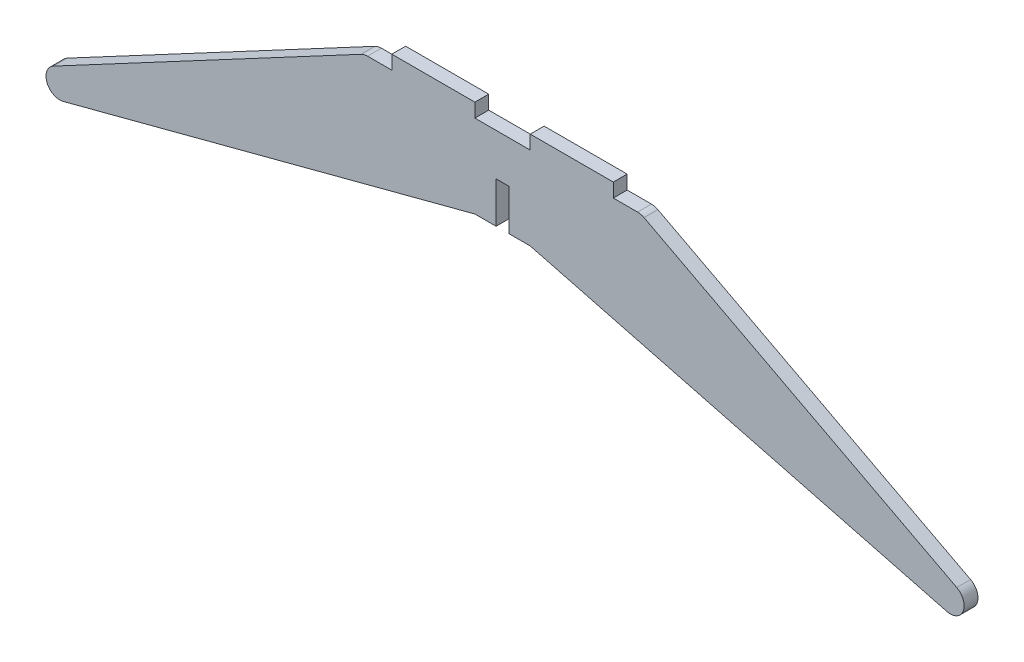
ISO-10303-21;
HEADER;
FILE_DESCRIPTION(('STEP AP214'),'2;1');
FILE_NAME('part.step','',(''),(''),'','','');
FILE_SCHEMA(('AUTOMOTIVE_DESIGN { 1 0 10303 214 1 1 1 1 }'));
ENDSEC;
DATA;
#1=APPLICATION_CONTEXT('core data for automotive mechanical design processes');
#2=APPLICATION_PROTOCOL_DEFINITION('international standard','automotive_design',2000,#1);
#3=PRODUCT_CONTEXT('',#1,'mechanical');
#4=PRODUCT('Part','Part','',(#3));
#5=PRODUCT_RELATED_PRODUCT_CATEGORY('part','',(#4));
#6=PRODUCT_DEFINITION_FORMATION('','',#4);
#7=PRODUCT_DEFINITION_CONTEXT('part definition',#1,'design');
#8=PRODUCT_DEFINITION('design','',#6,#7);
#9=PRODUCT_DEFINITION_SHAPE('','',#8);
#10=(LENGTH_UNIT() NAMED_UNIT(*) SI_UNIT(.MILLI.,.METRE.));
#11=(NAMED_UNIT(*) PLANE_ANGLE_UNIT() SI_UNIT($,.RADIAN.));
#12=(NAMED_UNIT(*) SI_UNIT($,.STERADIAN.) SOLID_ANGLE_UNIT());
#13=UNCERTAINTY_MEASURE_WITH_UNIT(LENGTH_MEASURE(1.E-05),#10,'distance_accuracy_value','');
#14=(GEOMETRIC_REPRESENTATION_CONTEXT(3) GLOBAL_UNCERTAINTY_ASSIGNED_CONTEXT((#13)) GLOBAL_UNIT_ASSIGNED_CONTEXT((#10,
#11,#12)) REPRESENTATION_CONTEXT('',''));
#15=CARTESIAN_POINT('',(0.,0.,0.));
#16=DIRECTION('',(0.,0.,1.));
#17=DIRECTION('',(1.,0.,0.));
#18=AXIS2_PLACEMENT_3D('',#15,#16,#17);
#19=CARTESIAN_POINT('',(25.4000003542452,3.17499995722947,3.175));
#20=DIRECTION('',(-0.999999999999994,1.11573281645451E-07,0.));
#21=DIRECTION('',(-1.11573281645451E-07,-0.999999999999994,0.));
#22=AXIS2_PLACEMENT_3D('',#19,#20,#21);
#23=PLANE('',#22);
#24=DIRECTION('',(1.11573281645451E-07,0.999999999999994,0.));
#25=VECTOR('',#24,1.);
#26=CARTESIAN_POINT('',(25.4000003542452,3.17499995722947,0.));
#27=LINE('',#26,#25);
#28=CARTESIAN_POINT('',(25.4,0.,0.));
#29=VERTEX_POINT('',#28);
#30=CARTESIAN_POINT('',(25.4000003542452,3.17499995722947,0.));
#31=VERTEX_POINT('',#30);
#32=EDGE_CURVE('E213',#29,#31,#27,.T.);
#33=ORIENTED_EDGE('',*,*,#32,.T.);
#34=DIRECTION('',(0.,0.,-1.));
#35=VECTOR('',#34,1.);
#36=CARTESIAN_POINT('',(25.4000003542452,3.17499995722947,3.175));
#37=LINE('',#36,#35);
#38=CARTESIAN_POINT('',(25.4000003542452,3.17499995722947,3.175));
#39=VERTEX_POINT('',#38);
#40=EDGE_CURVE('E11',#39,#31,#37,.T.);
#41=ORIENTED_EDGE('',*,*,#40,.F.);
#42=DIRECTION('',(1.11573281645451E-07,0.999999999999994,0.));
#43=VECTOR('',#42,1.);
#44=CARTESIAN_POINT('',(25.4000003542452,3.17499995722947,3.175));
#45=LINE('',#44,#43);
#46=CARTESIAN_POINT('',(25.4,0.,3.175));
#47=VERTEX_POINT('',#46);
#48=EDGE_CURVE('E255',#47,#39,#45,.T.);
#49=ORIENTED_EDGE('',*,*,#48,.F.);
#50=DIRECTION('',(0.,0.,-1.));
#51=VECTOR('',#50,1.);
#52=CARTESIAN_POINT('',(25.4,0.,3.175));
#53=LINE('',#52,#51);
#54=EDGE_CURVE('E209',#47,#29,#53,.T.);
#55=ORIENTED_EDGE('',*,*,#54,.T.);
#56=EDGE_LOOP('',(#33,#41,#49,#55));
#57=FACE_BOUND('',#56,.T.);
#58=ADVANCED_FACE('F33',(#57),#23,.F.);
#59=CARTESIAN_POINT('',(25.4000003542452,3.17499995722947,3.175));
#60=DIRECTION('',(0.,-1.,0.));
#61=DIRECTION('',(0.,0.,-1.));
#62=AXIS2_PLACEMENT_3D('',#59,#60,#61);
#63=PLANE('',#62);
#64=DIRECTION('',(-1.,0.,0.));
#65=VECTOR('',#64,1.);
#66=CARTESIAN_POINT('',(25.4000003542452,3.17499995722947,0.));
#67=LINE('',#66,#65);
#68=CARTESIAN_POINT('',(6.35000035424518,3.17499995722947,0.));
#69=VERTEX_POINT('',#68);
#70=EDGE_CURVE('E216',#31,#69,#67,.T.);
#71=ORIENTED_EDGE('',*,*,#70,.T.);
#72=DIRECTION('',(0.,0.,-1.));
#73=VECTOR('',#72,1.);
#74=CARTESIAN_POINT('',(6.35000035424518,3.17499995722947,3.175));
#75=LINE('',#74,#73);
#76=CARTESIAN_POINT('',(6.35000035424518,3.17499995722947,3.175));
#77=VERTEX_POINT('',#76);
#78=EDGE_CURVE('E41',#77,#69,#75,.T.);
#79=ORIENTED_EDGE('',*,*,#78,.F.);
#80=DIRECTION('',(-1.,0.,0.));
#81=VECTOR('',#80,1.);
#82=CARTESIAN_POINT('',(25.4000003542452,3.17499995722947,3.175));
#83=LINE('',#82,#81);
#84=EDGE_CURVE('E134',#39,#77,#83,.T.);
#85=ORIENTED_EDGE('',*,*,#84,.F.);
#86=ORIENTED_EDGE('',*,*,#40,.T.);
#87=EDGE_LOOP('',(#71,#79,#85,#86));
#88=FACE_BOUND('',#87,.T.);
#89=ADVANCED_FACE('F383',(#88),#63,.F.);
#90=CARTESIAN_POINT('',(6.35,0.,3.175));
#91=DIRECTION('',(0.999999999999994,-1.11573287382332E-07,0.));
#92=DIRECTION('',(1.11573287382332E-07,0.999999999999994,0.));
#93=AXIS2_PLACEMENT_3D('',#90,#91,#92);
#94=PLANE('',#93);
#95=DIRECTION('',(-1.11573287382332E-07,-0.999999999999994,0.));
#96=VECTOR('',#95,1.);
#97=CARTESIAN_POINT('',(6.35,0.,0.));
#98=LINE('',#97,#96);
#99=CARTESIAN_POINT('',(6.35,0.,0.));
#100=VERTEX_POINT('',#99);
#101=EDGE_CURVE('E218',#69,#100,#98,.T.);
#102=ORIENTED_EDGE('',*,*,#101,.T.);
#103=DIRECTION('',(0.,0.,-1.));
#104=VECTOR('',#103,1.);
#105=CARTESIAN_POINT('',(6.35,0.,3.175));
#106=LINE('',#105,#104);
#107=CARTESIAN_POINT('',(6.35,0.,3.175));
#108=VERTEX_POINT('',#107);
#109=EDGE_CURVE('E304',#108,#100,#106,.T.);
#110=ORIENTED_EDGE('',*,*,#109,.F.);
#111=DIRECTION('',(-1.11573287382332E-07,-0.999999999999994,0.));
#112=VECTOR('',#111,1.);
#113=CARTESIAN_POINT('',(6.35,0.,3.175));
#114=LINE('',#113,#112);
#115=EDGE_CURVE('E312',#77,#108,#114,.T.);
#116=ORIENTED_EDGE('',*,*,#115,.F.);
#117=ORIENTED_EDGE('',*,*,#78,.T.);
#118=EDGE_LOOP('',(#102,#110,#116,#117));
#119=FACE_BOUND('',#118,.T.);
#120=ADVANCED_FACE('F310',(#119),#94,.F.);
#121=CARTESIAN_POINT('',(-6.35,0.,3.175));
#122=DIRECTION('',(0.,-1.,0.));
#123=DIRECTION('',(0.,0.,-1.));
#124=AXIS2_PLACEMENT_3D('',#121,#122,#123);
#125=PLANE('',#124);
#126=DIRECTION('',(-1.,0.,0.));
#127=VECTOR('',#126,1.);
#128=CARTESIAN_POINT('',(-6.35,0.,0.));
#129=LINE('',#128,#127);
#130=CARTESIAN_POINT('',(-6.35,0.,0.));
#131=VERTEX_POINT('',#130);
#132=EDGE_CURVE('E220',#100,#131,#129,.T.);
#133=ORIENTED_EDGE('',*,*,#132,.T.);
#134=DIRECTION('',(0.,0.,-1.));
#135=VECTOR('',#134,1.);
#136=CARTESIAN_POINT('',(-6.35,0.,3.175));
#137=LINE('',#136,#135);
#138=CARTESIAN_POINT('',(-6.35,0.,3.175));
#139=VERTEX_POINT('',#138);
#140=EDGE_CURVE('E301',#139,#131,#137,.T.);
#141=ORIENTED_EDGE('',*,*,#140,.F.);
#142=DIRECTION('',(-1.,0.,0.));
#143=VECTOR('',#142,1.);
#144=CARTESIAN_POINT('',(-6.35,0.,3.175));
#145=LINE('',#144,#143);
#146=EDGE_CURVE('E330',#108,#139,#145,.T.);
#147=ORIENTED_EDGE('',*,*,#146,.F.);
#148=ORIENTED_EDGE('',*,*,#109,.T.);
#149=EDGE_LOOP('',(#133,#141,#147,#148));
#150=FACE_BOUND('',#149,.T.);
#151=ADVANCED_FACE('F321',(#150),#125,.F.);
#152=CARTESIAN_POINT('',(-6.34999964575481,3.17499995722947,3.175));
#153=DIRECTION('',(-0.999999999999994,1.11573287928702E-07,0.));
#154=DIRECTION('',(-1.11573287928702E-07,-0.999999999999994,0.));
#155=AXIS2_PLACEMENT_3D('',#152,#153,#154);
#156=PLANE('',#155);
#157=DIRECTION('',(1.11573287928702E-07,0.999999999999994,0.));
#158=VECTOR('',#157,1.);
#159=CARTESIAN_POINT('',(-6.34999964575481,3.17499995722947,0.));
#160=LINE('',#159,#158);
#161=CARTESIAN_POINT('',(-6.34999964575481,3.17499995722947,0.));
#162=VERTEX_POINT('',#161);
#163=EDGE_CURVE('E222',#131,#162,#160,.T.);
#164=ORIENTED_EDGE('',*,*,#163,.T.);
#165=DIRECTION('',(0.,0.,-1.));
#166=VECTOR('',#165,1.);
#167=CARTESIAN_POINT('',(-6.34999964575481,3.17499995722947,3.175));
#168=LINE('',#167,#166);
#169=CARTESIAN_POINT('',(-6.34999964575481,3.17499995722947,3.175));
#170=VERTEX_POINT('',#169);
#171=EDGE_CURVE('E298',#170,#162,#168,.T.);
#172=ORIENTED_EDGE('',*,*,#171,.F.);
#173=DIRECTION('',(1.11573287928702E-07,0.999999999999994,0.));
#174=VECTOR('',#173,1.);
#175=CARTESIAN_POINT('',(-6.34999964575481,3.17499995722947,3.175));
#176=LINE('',#175,#174);
#177=EDGE_CURVE('E327',#139,#170,#176,.T.);
#178=ORIENTED_EDGE('',*,*,#177,.F.);
#179=ORIENTED_EDGE('',*,*,#140,.T.);
#180=EDGE_LOOP('',(#164,#172,#178,#179));
#181=FACE_BOUND('',#180,.T.);
#182=ADVANCED_FACE('F325',(#181),#156,.F.);
#183=CARTESIAN_POINT('',(-6.34999964575481,3.17499995722947,3.175));
#184=DIRECTION('',(0.,-1.,0.));
#185=DIRECTION('',(0.,0.,-1.));
#186=AXIS2_PLACEMENT_3D('',#183,#184,#185);
#187=PLANE('',#186);
#188=DIRECTION('',(-1.,0.,0.));
#189=VECTOR('',#188,1.);
#190=CARTESIAN_POINT('',(-6.34999964575481,3.17499995722947,0.));
#191=LINE('',#190,#189);
#192=CARTESIAN_POINT('',(-25.3999996457548,3.17499995722947,0.));
#193=VERTEX_POINT('',#192);
#194=EDGE_CURVE('E224',#162,#193,#191,.T.);
#195=ORIENTED_EDGE('',*,*,#194,.T.);
#196=DIRECTION('',(0.,0.,-1.));
#197=VECTOR('',#196,1.);
#198=CARTESIAN_POINT('',(-25.3999996457548,3.17499995722947,3.175));
#199=LINE('',#198,#197);
#200=CARTESIAN_POINT('',(-25.3999996457548,3.17499995722947,3.175));
#201=VERTEX_POINT('',#200);
#202=EDGE_CURVE('E295',#201,#193,#199,.T.);
#203=ORIENTED_EDGE('',*,*,#202,.F.);
#204=DIRECTION('',(-1.,0.,0.));
#205=VECTOR('',#204,1.);
#206=CARTESIAN_POINT('',(-6.34999964575481,3.17499995722947,3.175));
#207=LINE('',#206,#205);
#208=EDGE_CURVE('E329',#170,#201,#207,.T.);
#209=ORIENTED_EDGE('',*,*,#208,.F.);
#210=ORIENTED_EDGE('',*,*,#171,.T.);
#211=EDGE_LOOP('',(#195,#203,#209,#210));
#212=FACE_BOUND('',#211,.T.);
#213=ADVANCED_FACE('F396',(#212),#187,.F.);
#214=CARTESIAN_POINT('',(-25.4,0.,3.175));
#215=DIRECTION('',(0.999999999999994,-1.11573287109147E-07,0.));
#216=DIRECTION('',(1.11573287109147E-07,0.999999999999994,0.));
#217=AXIS2_PLACEMENT_3D('',#214,#215,#216);
#218=PLANE('',#217);
#219=DIRECTION('',(-1.11573287109147E-07,-0.999999999999994,0.));
#220=VECTOR('',#219,1.);
#221=CARTESIAN_POINT('',(-25.4,0.,0.));
#222=LINE('',#221,#220);
#223=CARTESIAN_POINT('',(-25.4,0.,0.));
#224=VERTEX_POINT('',#223);
#225=EDGE_CURVE('E226',#193,#224,#222,.T.);
#226=ORIENTED_EDGE('',*,*,#225,.T.);
#227=DIRECTION('',(0.,0.,-1.));
#228=VECTOR('',#227,1.);
#229=CARTESIAN_POINT('',(-25.4,0.,3.175));
#230=LINE('',#229,#228);
#231=CARTESIAN_POINT('',(-25.4,0.,3.175));
#232=VERTEX_POINT('',#231);
#233=EDGE_CURVE('E292',#232,#224,#230,.T.);
#234=ORIENTED_EDGE('',*,*,#233,.F.);
#235=DIRECTION('',(-1.11573287109147E-07,-0.999999999999994,0.));
#236=VECTOR('',#235,1.);
#237=CARTESIAN_POINT('',(-25.4,0.,3.175));
#238=LINE('',#237,#236);
#239=EDGE_CURVE('E332',#201,#232,#238,.T.);
#240=ORIENTED_EDGE('',*,*,#239,.F.);
#241=ORIENTED_EDGE('',*,*,#202,.T.);
#242=EDGE_LOOP('',(#226,#234,#240,#241));
#243=FACE_BOUND('',#242,.T.);
#244=ADVANCED_FACE('F399',(#243),#218,.F.);
#245=CARTESIAN_POINT('',(-30.95625,0.,3.175));
#246=DIRECTION('',(0.,-1.,0.));
#247=DIRECTION('',(1.,0.,0.));
#248=AXIS2_PLACEMENT_3D('',#245,#246,#247);
#249=PLANE('',#248);
#250=DIRECTION('',(-1.,0.,0.));
#251=VECTOR('',#250,1.);
#252=CARTESIAN_POINT('',(-30.95625,0.,0.));
#253=LINE('',#252,#251);
#254=CARTESIAN_POINT('',(-30.95625,0.,0.));
#255=VERTEX_POINT('',#254);
#256=EDGE_CURVE('E228',#224,#255,#253,.T.);
#257=ORIENTED_EDGE('',*,*,#256,.T.);
#258=DIRECTION('',(0.,0.,-1.));
#259=VECTOR('',#258,1.);
#260=CARTESIAN_POINT('',(-30.95625,0.,3.175));
#261=LINE('',#260,#259);
#262=CARTESIAN_POINT('',(-30.95625,0.,3.175));
#263=VERTEX_POINT('',#262);
#264=EDGE_CURVE('E289',#263,#255,#261,.T.);
#265=ORIENTED_EDGE('',*,*,#264,.F.);
#266=DIRECTION('',(-1.,0.,0.));
#267=VECTOR('',#266,1.);
#268=CARTESIAN_POINT('',(-30.95625,0.,3.175));
#269=LINE('',#268,#267);
#270=EDGE_CURVE('E338',#232,#263,#269,.T.);
#271=ORIENTED_EDGE('',*,*,#270,.F.);
#272=ORIENTED_EDGE('',*,*,#233,.T.);
#273=EDGE_LOOP('',(#257,#265,#271,#272));
#274=FACE_BOUND('',#273,.T.);
#275=ADVANCED_FACE('F403',(#274),#249,.F.);
#276=CARTESIAN_POINT('',(-30.95625,-3.175,3.175));
#277=DIRECTION('',(0.,0.,-1.));
#278=DIRECTION('',(-1.,0.,0.));
#279=AXIS2_PLACEMENT_3D('',#276,#277,#278);
#280=CYLINDRICAL_SURFACE('',#279,3.17500000000004);
#281=CARTESIAN_POINT('',(-30.95625,-3.175,0.));
#282=DIRECTION('',(0.,0.,1.));
#283=DIRECTION('',(1.,0.,0.));
#284=AXIS2_PLACEMENT_3D('',#281,#282,#283);
#285=CIRCLE('',#284,3.17500000000004);
#286=CARTESIAN_POINT('',(-32.4503676470611,-0.373529411765896,0.));
#287=VERTEX_POINT('',#286);
#288=EDGE_CURVE('E230',#255,#287,#285,.T.);
#289=ORIENTED_EDGE('',*,*,#288,.T.);
#290=DIRECTION('',(0.,0.,-1.));
#291=VECTOR('',#290,1.);
#292=CARTESIAN_POINT('',(-32.4503676470611,-0.373529411765896,3.175));
#293=LINE('',#292,#291);
#294=CARTESIAN_POINT('',(-32.4503676470611,-0.373529411765896,3.175));
#295=VERTEX_POINT('',#294);
#296=EDGE_CURVE('E286',#295,#287,#293,.T.);
#297=ORIENTED_EDGE('',*,*,#296,.F.);
#298=CARTESIAN_POINT('',(-30.95625,-3.175,3.175));
#299=DIRECTION('',(0.,0.,1.));
#300=DIRECTION('',(1.,0.,0.));
#301=AXIS2_PLACEMENT_3D('',#298,#299,#300);
#302=CIRCLE('',#301,3.17500000000004);
#303=EDGE_CURVE('E340',#263,#295,#302,.T.);
#304=ORIENTED_EDGE('',*,*,#303,.F.);
#305=ORIENTED_EDGE('',*,*,#264,.T.);
#306=EDGE_LOOP('',(#289,#297,#304,#305));
#307=FACE_BOUND('',#306,.T.);
#308=ADVANCED_FACE('F407',(#307),#280,.T.);
#309=CARTESIAN_POINT('',(-32.4503676470611,-0.373529411765896,3.175));
#310=DIRECTION('',(0.470588235285876,-0.882352941180866,0.));
#311=DIRECTION('',(0.882352941180866,0.470588235285876,0.));
#312=AXIS2_PLACEMENT_3D('',#309,#310,#311);
#313=PLANE('',#312);
#314=DIRECTION('',(-0.882352941180866,-0.470588235285876,0.));
#315=VECTOR('',#314,1.);
#316=CARTESIAN_POINT('',(-32.4503676470611,-0.373529411765896,0.));
#317=LINE('',#316,#315);
#318=CARTESIAN_POINT('',(-103.0238866239,-38.0127395319,0.));
#319=VERTEX_POINT('',#318);
#320=EDGE_CURVE('E232',#287,#319,#317,.T.);
#321=ORIENTED_EDGE('',*,*,#320,.T.);
#322=DIRECTION('',(0.,0.,-1.));
#323=VECTOR('',#322,1.);
#324=CARTESIAN_POINT('',(-103.0238866239,-38.0127395319,3.175));
#325=LINE('',#324,#323);
#326=CARTESIAN_POINT('',(-103.0238866239,-38.0127395319,3.175));
#327=VERTEX_POINT('',#326);
#328=EDGE_CURVE('E283',#327,#319,#325,.T.);
#329=ORIENTED_EDGE('',*,*,#328,.F.);
#330=DIRECTION('',(-0.882352941180866,-0.470588235285876,0.));
#331=VECTOR('',#330,1.);
#332=CARTESIAN_POINT('',(-32.4503676470611,-0.373529411765896,3.175));
#333=LINE('',#332,#331);
#334=EDGE_CURVE('E342',#295,#327,#333,.T.);
#335=ORIENTED_EDGE('',*,*,#334,.F.);
#336=ORIENTED_EDGE('',*,*,#296,.T.);
#337=EDGE_LOOP('',(#321,#329,#335,#336));
#338=FACE_BOUND('',#337,.T.);
#339=ADVANCED_FACE('F411',(#338),#313,.F.);
#340=CARTESIAN_POINT('',(-101.529768981527,-40.8142101226345,3.175));
#341=DIRECTION('',(0.,0.,-1.));
#342=DIRECTION('',(-1.,0.,0.));
#343=AXIS2_PLACEMENT_3D('',#340,#341,#342);
#344=CYLINDRICAL_SURFACE('',#343,3.175);
#345=CARTESIAN_POINT('',(-101.529768981527,-40.8142101226345,0.));
#346=DIRECTION('',(0.,0.,1.));
#347=DIRECTION('',(1.,0.,0.));
#348=AXIS2_PLACEMENT_3D('',#345,#346,#347);
#349=CIRCLE('',#348,3.175);
#350=CARTESIAN_POINT('',(-100.721752751926,-43.8846717772885,0.));
#351=VERTEX_POINT('',#350);
#352=EDGE_CURVE('E234',#319,#351,#349,.T.);
#353=ORIENTED_EDGE('',*,*,#352,.T.);
#354=DIRECTION('',(0.,0.,-1.));
#355=VECTOR('',#354,1.);
#356=CARTESIAN_POINT('',(-100.721752751926,-43.8846717772885,3.175));
#357=LINE('',#356,#355);
#358=CARTESIAN_POINT('',(-100.721752751926,-43.8846717772885,3.175));
#359=VERTEX_POINT('',#358);
#360=EDGE_CURVE('E280',#359,#351,#357,.T.);
#361=ORIENTED_EDGE('',*,*,#360,.F.);
#362=CARTESIAN_POINT('',(-101.529768981527,-40.8142101226345,3.175));
#363=DIRECTION('',(0.,0.,1.));
#364=DIRECTION('',(1.,0.,0.));
#365=AXIS2_PLACEMENT_3D('',#362,#363,#364);
#366=CIRCLE('',#365,3.175);
#367=EDGE_CURVE('E344',#327,#359,#366,.T.);
#368=ORIENTED_EDGE('',*,*,#367,.F.);
#369=ORIENTED_EDGE('',*,*,#328,.T.);
#370=EDGE_LOOP('',(#353,#361,#368,#369));
#371=FACE_BOUND('',#370,.T.);
#372=ADVANCED_FACE('F415',(#371),#344,.T.);
#373=CARTESIAN_POINT('',(-100.721752751926,-43.8846717772885,3.175));
#374=DIRECTION('',(-0.254493299284109,0.967074537261471,0.));
#375=DIRECTION('',(-0.967074537261471,-0.254493299284109,0.));
#376=AXIS2_PLACEMENT_3D('',#373,#374,#375);
#377=PLANE('',#376);
#378=DIRECTION('',(0.967074537261471,0.254493299284109,0.));
#379=VECTOR('',#378,1.);
#380=CARTESIAN_POINT('',(-100.721752751926,-43.8846717772885,0.));
#381=LINE('',#380,#379);
#382=CARTESIAN_POINT('',(-6.35,-19.05,0.));
#383=VERTEX_POINT('',#382);
#384=EDGE_CURVE('E236',#351,#383,#381,.T.);
#385=ORIENTED_EDGE('',*,*,#384,.T.);
#386=DIRECTION('',(0.,0.,-1.));
#387=VECTOR('',#386,1.);
#388=CARTESIAN_POINT('',(-6.35,-19.05,3.175));
#389=LINE('',#388,#387);
#390=CARTESIAN_POINT('',(-6.35,-19.05,3.175));
#391=VERTEX_POINT('',#390);
#392=EDGE_CURVE('E277',#391,#383,#389,.T.);
#393=ORIENTED_EDGE('',*,*,#392,.F.);
#394=DIRECTION('',(0.967074537261471,0.254493299284109,0.));
#395=VECTOR('',#394,1.);
#396=CARTESIAN_POINT('',(-100.721752751926,-43.8846717772885,3.175));
#397=LINE('',#396,#395);
#398=EDGE_CURVE('E346',#359,#391,#397,.T.);
#399=ORIENTED_EDGE('',*,*,#398,.F.);
#400=ORIENTED_EDGE('',*,*,#360,.T.);
#401=EDGE_LOOP('',(#385,#393,#399,#400));
#402=FACE_BOUND('',#401,.T.);
#403=ADVANCED_FACE('F419',(#402),#377,.F.);
#404=CARTESIAN_POINT('',(-6.35,-19.05,3.175));
#405=DIRECTION('',(0.,1.,0.));
#406=DIRECTION('',(0.,0.,1.));
#407=AXIS2_PLACEMENT_3D('',#404,#405,#406);
#408=PLANE('',#407);
#409=DIRECTION('',(1.,0.,0.));
#410=VECTOR('',#409,1.);
#411=CARTESIAN_POINT('',(-6.35,-19.05,0.));
#412=LINE('',#411,#410);
#413=CARTESIAN_POINT('',(-1.4859,-19.05,0.));
#414=VERTEX_POINT('',#413);
#415=EDGE_CURVE('E238',#383,#414,#412,.T.);
#416=ORIENTED_EDGE('',*,*,#415,.T.);
#417=DIRECTION('',(0.,0.,-1.));
#418=VECTOR('',#417,1.);
#419=CARTESIAN_POINT('',(-1.4859,-19.05,3.175));
#420=LINE('',#419,#418);
#421=CARTESIAN_POINT('',(-1.4859,-19.05,3.175));
#422=VERTEX_POINT('',#421);
#423=EDGE_CURVE('E274',#422,#414,#420,.T.);
#424=ORIENTED_EDGE('',*,*,#423,.F.);
#425=DIRECTION('',(1.,0.,0.));
#426=VECTOR('',#425,1.);
#427=CARTESIAN_POINT('',(-6.35,-19.05,3.175));
#428=LINE('',#427,#426);
#429=EDGE_CURVE('E348',#391,#422,#428,.T.);
#430=ORIENTED_EDGE('',*,*,#429,.F.);
#431=ORIENTED_EDGE('',*,*,#392,.T.);
#432=EDGE_LOOP('',(#416,#424,#430,#431));
#433=FACE_BOUND('',#432,.T.);
#434=ADVANCED_FACE('F423',(#433),#408,.F.);
#435=CARTESIAN_POINT('',(-1.4859,-19.05,3.175));
#436=DIRECTION('',(-1.,0.,0.));
#437=DIRECTION('',(0.,0.,1.));
#438=AXIS2_PLACEMENT_3D('',#435,#436,#437);
#439=PLANE('',#438);
#440=DIRECTION('',(0.,1.,0.));
#441=VECTOR('',#440,1.);
#442=CARTESIAN_POINT('',(-1.4859,-19.05,0.));
#443=LINE('',#442,#441);
#444=CARTESIAN_POINT('',(-1.4859,-9.6266,0.));
#445=VERTEX_POINT('',#444);
#446=EDGE_CURVE('E240',#414,#445,#443,.T.);
#447=ORIENTED_EDGE('',*,*,#446,.T.);
#448=DIRECTION('',(0.,0.,-1.));
#449=VECTOR('',#448,1.);
#450=CARTESIAN_POINT('',(-1.4859,-9.6266,3.175));
#451=LINE('',#450,#449);
#452=CARTESIAN_POINT('',(-1.4859,-9.6266,3.175));
#453=VERTEX_POINT('',#452);
#454=EDGE_CURVE('E271',#453,#445,#451,.T.);
#455=ORIENTED_EDGE('',*,*,#454,.F.);
#456=DIRECTION('',(0.,1.,0.));
#457=VECTOR('',#456,1.);
#458=CARTESIAN_POINT('',(-1.4859,-19.05,3.175));
#459=LINE('',#458,#457);
#460=EDGE_CURVE('E350',#422,#453,#459,.T.);
#461=ORIENTED_EDGE('',*,*,#460,.F.);
#462=ORIENTED_EDGE('',*,*,#423,.T.);
#463=EDGE_LOOP('',(#447,#455,#461,#462));
#464=FACE_BOUND('',#463,.T.);
#465=ADVANCED_FACE('F427',(#464),#439,.F.);
#466=CARTESIAN_POINT('',(-1.4859,-9.6266,3.175));
#467=DIRECTION('',(0.,1.,0.));
#468=DIRECTION('',(0.,0.,1.));
#469=AXIS2_PLACEMENT_3D('',#466,#467,#468);
#470=PLANE('',#469);
#471=DIRECTION('',(1.,0.,0.));
#472=VECTOR('',#471,1.);
#473=CARTESIAN_POINT('',(-1.4859,-9.6266,0.));
#474=LINE('',#473,#472);
#475=CARTESIAN_POINT('',(1.4859,-9.6266,0.));
#476=VERTEX_POINT('',#475);
#477=EDGE_CURVE('E242',#445,#476,#474,.T.);
#478=ORIENTED_EDGE('',*,*,#477,.T.);
#479=DIRECTION('',(0.,0.,-1.));
#480=VECTOR('',#479,1.);
#481=CARTESIAN_POINT('',(1.4859,-9.6266,3.175));
#482=LINE('',#481,#480);
#483=CARTESIAN_POINT('',(1.4859,-9.6266,3.175));
#484=VERTEX_POINT('',#483);
#485=EDGE_CURVE('E268',#484,#476,#482,.T.);
#486=ORIENTED_EDGE('',*,*,#485,.F.);
#487=DIRECTION('',(1.,0.,0.));
#488=VECTOR('',#487,1.);
#489=CARTESIAN_POINT('',(-1.4859,-9.6266,3.175));
#490=LINE('',#489,#488);
#491=EDGE_CURVE('E352',#453,#484,#490,.T.);
#492=ORIENTED_EDGE('',*,*,#491,.F.);
#493=ORIENTED_EDGE('',*,*,#454,.T.);
#494=EDGE_LOOP('',(#478,#486,#492,#493));
#495=FACE_BOUND('',#494,.T.);
#496=ADVANCED_FACE('F431',(#495),#470,.F.);
#497=CARTESIAN_POINT('',(1.4859,-19.05,3.175));
#498=DIRECTION('',(1.,0.,0.));
#499=DIRECTION('',(0.,0.,-1.));
#500=AXIS2_PLACEMENT_3D('',#497,#498,#499);
#501=PLANE('',#500);
#502=DIRECTION('',(0.,-1.,0.));
#503=VECTOR('',#502,1.);
#504=CARTESIAN_POINT('',(1.4859,-19.05,0.));
#505=LINE('',#504,#503);
#506=CARTESIAN_POINT('',(1.4859,-19.05,0.));
#507=VERTEX_POINT('',#506);
#508=EDGE_CURVE('E244',#476,#507,#505,.T.);
#509=ORIENTED_EDGE('',*,*,#508,.T.);
#510=DIRECTION('',(0.,0.,-1.));
#511=VECTOR('',#510,1.);
#512=CARTESIAN_POINT('',(1.4859,-19.05,3.175));
#513=LINE('',#512,#511);
#514=CARTESIAN_POINT('',(1.4859,-19.05,3.175));
#515=VERTEX_POINT('',#514);
#516=EDGE_CURVE('E265',#515,#507,#513,.T.);
#517=ORIENTED_EDGE('',*,*,#516,.F.);
#518=DIRECTION('',(0.,-1.,0.));
#519=VECTOR('',#518,1.);
#520=CARTESIAN_POINT('',(1.4859,-19.05,3.175));
#521=LINE('',#520,#519);
#522=EDGE_CURVE('E354',#484,#515,#521,.T.);
#523=ORIENTED_EDGE('',*,*,#522,.F.);
#524=ORIENTED_EDGE('',*,*,#485,.T.);
#525=EDGE_LOOP('',(#509,#517,#523,#524));
#526=FACE_BOUND('',#525,.T.);
#527=ADVANCED_FACE('F435',(#526),#501,.F.);
#528=CARTESIAN_POINT('',(1.4859,-19.05,3.175));
#529=DIRECTION('',(0.,1.,0.));
#530=DIRECTION('',(0.,0.,1.));
#531=AXIS2_PLACEMENT_3D('',#528,#529,#530);
#532=PLANE('',#531);
#533=DIRECTION('',(1.,0.,0.));
#534=VECTOR('',#533,1.);
#535=CARTESIAN_POINT('',(1.4859,-19.05,0.));
#536=LINE('',#535,#534);
#537=CARTESIAN_POINT('',(6.35,-19.05,0.));
#538=VERTEX_POINT('',#537);
#539=EDGE_CURVE('E246',#507,#538,#536,.T.);
#540=ORIENTED_EDGE('',*,*,#539,.T.);
#541=DIRECTION('',(0.,0.,-1.));
#542=VECTOR('',#541,1.);
#543=CARTESIAN_POINT('',(6.35,-19.05,3.175));
#544=LINE('',#543,#542);
#545=CARTESIAN_POINT('',(6.35,-19.05,3.175));
#546=VERTEX_POINT('',#545);
#547=EDGE_CURVE('E262',#546,#538,#544,.T.);
#548=ORIENTED_EDGE('',*,*,#547,.F.);
#549=DIRECTION('',(1.,0.,0.));
#550=VECTOR('',#549,1.);
#551=CARTESIAN_POINT('',(1.4859,-19.05,3.175));
#552=LINE('',#551,#550);
#553=EDGE_CURVE('E356',#515,#546,#552,.T.);
#554=ORIENTED_EDGE('',*,*,#553,.F.);
#555=ORIENTED_EDGE('',*,*,#516,.T.);
#556=EDGE_LOOP('',(#540,#548,#554,#555));
#557=FACE_BOUND('',#556,.T.);
#558=ADVANCED_FACE('F439',(#557),#532,.F.);
#559=CARTESIAN_POINT('',(6.35,-19.05,3.175));
#560=DIRECTION('',(0.251328478078424,0.967901852517487,0.));
#561=DIRECTION('',(-0.967901852517487,0.251328478078424,0.));
#562=AXIS2_PLACEMENT_3D('',#559,#560,#561);
#563=PLANE('',#562);
#564=DIRECTION('',(0.967901852517487,-0.251328478078424,0.));
#565=VECTOR('',#564,1.);
#566=CARTESIAN_POINT('',(6.35,-19.05,0.));
#567=LINE('',#566,#565);
#568=CARTESIAN_POINT('',(101.892440564182,-43.858854447833,0.));
#569=VERTEX_POINT('',#568);
#570=EDGE_CURVE('E248',#538,#569,#567,.T.);
#571=ORIENTED_EDGE('',*,*,#570,.T.);
#572=DIRECTION('',(0.,0.,-1.));
#573=VECTOR('',#572,1.);
#574=CARTESIAN_POINT('',(101.892440564182,-43.858854447833,3.175));
#575=LINE('',#574,#573);
#576=CARTESIAN_POINT('',(101.892440564182,-43.858854447833,3.175));
#577=VERTEX_POINT('',#576);
#578=EDGE_CURVE('E259',#577,#569,#575,.T.);
#579=ORIENTED_EDGE('',*,*,#578,.F.);
#580=DIRECTION('',(0.967901852517487,-0.251328478078424,0.));
#581=VECTOR('',#580,1.);
#582=CARTESIAN_POINT('',(6.35,-19.05,3.175));
#583=LINE('',#582,#581);
#584=EDGE_CURVE('E358',#546,#577,#583,.T.);
#585=ORIENTED_EDGE('',*,*,#584,.F.);
#586=ORIENTED_EDGE('',*,*,#547,.T.);
#587=EDGE_LOOP('',(#571,#579,#585,#586));
#588=FACE_BOUND('',#587,.T.);
#589=ADVANCED_FACE('F364',(#588),#563,.F.);
#590=CARTESIAN_POINT('',(102.69040848212,-40.7857660661,3.175));
#591=DIRECTION('',(0.,0.,-1.));
#592=DIRECTION('',(-1.,0.,0.));
#593=AXIS2_PLACEMENT_3D('',#590,#591,#592);
#594=CYLINDRICAL_SURFACE('',#593,3.175);
#595=CARTESIAN_POINT('',(102.69040848212,-40.7857660661,0.));
#596=DIRECTION('',(0.,0.,1.));
#597=DIRECTION('',(1.,0.,0.));
#598=AXIS2_PLACEMENT_3D('',#595,#596,#597);
#599=CIRCLE('',#598,3.175);
#600=CARTESIAN_POINT('',(104.164919451919,-37.9739263836247,0.));
#601=VERTEX_POINT('',#600);
#602=EDGE_CURVE('E250',#569,#601,#599,.T.);
#603=ORIENTED_EDGE('',*,*,#602,.T.);
#604=DIRECTION('',(0.,0.,-1.));
#605=VECTOR('',#604,1.);
#606=CARTESIAN_POINT('',(104.164919451919,-37.9739263836247,3.175));
#607=LINE('',#606,#605);
#608=CARTESIAN_POINT('',(104.164919451919,-37.9739263836247,3.175));
#609=VERTEX_POINT('',#608);
#610=EDGE_CURVE('E204',#609,#601,#607,.T.);
#611=ORIENTED_EDGE('',*,*,#610,.F.);
#612=CARTESIAN_POINT('',(102.69040848212,-40.7857660661,3.175));
#613=DIRECTION('',(0.,0.,1.));
#614=DIRECTION('',(1.,0.,0.));
#615=AXIS2_PLACEMENT_3D('',#612,#613,#614);
#616=CIRCLE('',#615,3.175);
#617=EDGE_CURVE('E195',#577,#609,#616,.T.);
#618=ORIENTED_EDGE('',*,*,#617,.F.);
#619=ORIENTED_EDGE('',*,*,#578,.T.);
#620=EDGE_LOOP('',(#603,#611,#618,#619));
#621=FACE_BOUND('',#620,.T.);
#622=ADVANCED_FACE('F368',(#621),#594,.T.);
#623=CARTESIAN_POINT('',(104.164919451919,-37.9739263836247,3.175));
#624=DIRECTION('',(-0.464412903852306,-0.885618797641214,0.));
#625=DIRECTION('',(0.885618797641214,-0.464412903852306,0.));
#626=AXIS2_PLACEMENT_3D('',#623,#624,#625);
#627=PLANE('',#626);
#628=DIRECTION('',(-0.885618797641214,0.464412903852306,0.));
#629=VECTOR('',#628,1.);
#630=CARTESIAN_POINT('',(104.164919451919,-37.9739263836247,0.));
#631=LINE('',#630,#629);
#632=CARTESIAN_POINT('',(32.44253373558,-0.36316031762,0.));
#633=VERTEX_POINT('',#632);
#634=EDGE_CURVE('E203',#601,#633,#631,.T.);
#635=ORIENTED_EDGE('',*,*,#634,.T.);
#636=DIRECTION('',(0.,0.,-1.));
#637=VECTOR('',#636,1.);
#638=CARTESIAN_POINT('',(32.44253373558,-0.36316031762,3.175));
#639=LINE('',#638,#637);
#640=CARTESIAN_POINT('',(32.44253373558,-0.36316031762,3.175));
#641=VERTEX_POINT('',#640);
#642=EDGE_CURVE('E200',#641,#633,#639,.T.);
#643=ORIENTED_EDGE('',*,*,#642,.F.);
#644=DIRECTION('',(-0.885618797641214,0.464412903852306,0.));
#645=VECTOR('',#644,1.);
#646=CARTESIAN_POINT('',(104.164919451919,-37.9739263836247,3.175));
#647=LINE('',#646,#645);
#648=EDGE_CURVE('E189',#609,#641,#647,.T.);
#649=ORIENTED_EDGE('',*,*,#648,.F.);
#650=ORIENTED_EDGE('',*,*,#610,.T.);
#651=EDGE_LOOP('',(#635,#643,#649,#650));
#652=FACE_BOUND('',#651,.T.);
#653=ADVANCED_FACE('F201',(#652),#627,.F.);
#654=CARTESIAN_POINT('',(30.9680227655994,-3.175,3.175));
#655=DIRECTION('',(0.,0.,-1.));
#656=DIRECTION('',(-1.,0.,0.));
#657=AXIS2_PLACEMENT_3D('',#654,#655,#656);
#658=CYLINDRICAL_SURFACE('',#657,3.17499999999997);
#659=CARTESIAN_POINT('',(30.9680227655994,-3.175,0.));
#660=DIRECTION('',(0.,0.,1.));
#661=DIRECTION('',(1.,0.,0.));
#662=AXIS2_PLACEMENT_3D('',#659,#660,#661);
#663=CIRCLE('',#662,3.17499999999997);
#664=CARTESIAN_POINT('',(30.96802276792,0.,0.));
#665=VERTEX_POINT('',#664);
#666=EDGE_CURVE('E120',#633,#665,#663,.T.);
#667=ORIENTED_EDGE('',*,*,#666,.T.);
#668=DIRECTION('',(0.,0.,-1.));
#669=VECTOR('',#668,1.);
#670=CARTESIAN_POINT('',(30.96802276792,0.,3.175));
#671=LINE('',#670,#669);
#672=CARTESIAN_POINT('',(30.96802276792,0.,3.175));
#673=VERTEX_POINT('',#672);
#674=EDGE_CURVE('E205',#673,#665,#671,.T.);
#675=ORIENTED_EDGE('',*,*,#674,.F.);
#676=CARTESIAN_POINT('',(30.9680227655994,-3.175,3.175));
#677=DIRECTION('',(0.,0.,1.));
#678=DIRECTION('',(1.,0.,0.));
#679=AXIS2_PLACEMENT_3D('',#676,#677,#678);
#680=CIRCLE('',#679,3.17499999999997);
#681=EDGE_CURVE('E193',#641,#673,#680,.T.);
#682=ORIENTED_EDGE('',*,*,#681,.F.);
#683=ORIENTED_EDGE('',*,*,#642,.T.);
#684=EDGE_LOOP('',(#667,#675,#682,#683));
#685=FACE_BOUND('',#684,.T.);
#686=ADVANCED_FACE('F207',(#685),#658,.T.);
#687=CARTESIAN_POINT('',(25.4,0.,3.175));
#688=DIRECTION('',(0.,-1.,0.));
#689=DIRECTION('',(1.,0.,0.));
#690=AXIS2_PLACEMENT_3D('',#687,#688,#689);
#691=PLANE('',#690);
#692=DIRECTION('',(-1.,0.,0.));
#693=VECTOR('',#692,1.);
#694=CARTESIAN_POINT('',(25.4,0.,0.));
#695=LINE('',#694,#693);
#696=EDGE_CURVE('E126',#665,#29,#695,.T.);
#697=ORIENTED_EDGE('',*,*,#696,.T.);
#698=ORIENTED_EDGE('',*,*,#54,.F.);
#699=DIRECTION('',(-1.,0.,0.));
#700=VECTOR('',#699,1.);
#701=CARTESIAN_POINT('',(25.4,0.,3.175));
#702=LINE('',#701,#700);
#703=EDGE_CURVE('E49',#673,#47,#702,.T.);
#704=ORIENTED_EDGE('',*,*,#703,.F.);
#705=ORIENTED_EDGE('',*,*,#674,.T.);
#706=EDGE_LOOP('',(#697,#698,#704,#705));
#707=FACE_BOUND('',#706,.T.);
#708=ADVANCED_FACE('F372',(#707),#691,.F.);
#709=CARTESIAN_POINT('',(30.9680227655994,-3.175,3.175));
#710=DIRECTION('',(0.,0.,1.));
#711=DIRECTION('',(1.,0.,0.));
#712=AXIS2_PLACEMENT_3D('',#709,#710,#711);
#713=PLANE('',#712);
#714=ORIENTED_EDGE('',*,*,#48,.T.);
#715=ORIENTED_EDGE('',*,*,#84,.T.);
#716=ORIENTED_EDGE('',*,*,#115,.T.);
#717=ORIENTED_EDGE('',*,*,#146,.T.);
#718=ORIENTED_EDGE('',*,*,#177,.T.);
#719=ORIENTED_EDGE('',*,*,#208,.T.);
#720=ORIENTED_EDGE('',*,*,#239,.T.);
#721=ORIENTED_EDGE('',*,*,#270,.T.);
#722=ORIENTED_EDGE('',*,*,#303,.T.);
#723=ORIENTED_EDGE('',*,*,#334,.T.);
#724=ORIENTED_EDGE('',*,*,#367,.T.);
#725=ORIENTED_EDGE('',*,*,#398,.T.);
#726=ORIENTED_EDGE('',*,*,#429,.T.);
#727=ORIENTED_EDGE('',*,*,#460,.T.);
#728=ORIENTED_EDGE('',*,*,#491,.T.);
#729=ORIENTED_EDGE('',*,*,#522,.T.);
#730=ORIENTED_EDGE('',*,*,#553,.T.);
#731=ORIENTED_EDGE('',*,*,#584,.T.);
#732=ORIENTED_EDGE('',*,*,#617,.T.);
#733=ORIENTED_EDGE('',*,*,#648,.T.);
#734=ORIENTED_EDGE('',*,*,#681,.T.);
#735=ORIENTED_EDGE('',*,*,#703,.T.);
#736=EDGE_LOOP('',(#714,#715,#716,#717,#718,#719,#720,#721,#722,#723,#724,#725,#726,#727,#728,
#729,#730,#731,#732,#733,#734,#735));
#737=FACE_BOUND('',#736,.T.);
#738=ADVANCED_FACE('F191',(#737),#713,.T.);
#739=CARTESIAN_POINT('',(30.9680227655994,-3.175,0.));
#740=DIRECTION('',(0.,0.,1.));
#741=DIRECTION('',(1.,0.,0.));
#742=AXIS2_PLACEMENT_3D('',#739,#740,#741);
#743=PLANE('',#742);
#744=ORIENTED_EDGE('',*,*,#32,.F.);
#745=ORIENTED_EDGE('',*,*,#696,.F.);
#746=ORIENTED_EDGE('',*,*,#666,.F.);
#747=ORIENTED_EDGE('',*,*,#634,.F.);
#748=ORIENTED_EDGE('',*,*,#602,.F.);
#749=ORIENTED_EDGE('',*,*,#570,.F.);
#750=ORIENTED_EDGE('',*,*,#539,.F.);
#751=ORIENTED_EDGE('',*,*,#508,.F.);
#752=ORIENTED_EDGE('',*,*,#477,.F.);
#753=ORIENTED_EDGE('',*,*,#446,.F.);
#754=ORIENTED_EDGE('',*,*,#415,.F.);
#755=ORIENTED_EDGE('',*,*,#384,.F.);
#756=ORIENTED_EDGE('',*,*,#352,.F.);
#757=ORIENTED_EDGE('',*,*,#320,.F.);
#758=ORIENTED_EDGE('',*,*,#288,.F.);
#759=ORIENTED_EDGE('',*,*,#256,.F.);
#760=ORIENTED_EDGE('',*,*,#225,.F.);
#761=ORIENTED_EDGE('',*,*,#194,.F.);
#762=ORIENTED_EDGE('',*,*,#163,.F.);
#763=ORIENTED_EDGE('',*,*,#132,.F.);
#764=ORIENTED_EDGE('',*,*,#101,.F.);
#765=ORIENTED_EDGE('',*,*,#70,.F.);
#766=EDGE_LOOP('',(#744,#745,#746,#747,#748,#749,#750,#751,#752,#753,#754,#755,#756,#757,#758,
#759,#760,#761,#762,#763,#764,#765));
#767=FACE_BOUND('',#766,.T.);
#768=ADVANCED_FACE('F316',(#767),#743,.F.);
#769=CLOSED_SHELL('',(#58,#89,#120,#151,#182,#213,#244,#275,#308,#339,#372,#403,#434,#465,#496,
#527,#558,#589,#622,#653,#686,#708,#738,#768));
#770=MANIFOLD_SOLID_BREP('B2',#769);
#771=ADVANCED_BREP_SHAPE_REPRESENTATION('',(#18,#770),#14);
#772=SHAPE_DEFINITION_REPRESENTATION(#9,#771);
ENDSEC;
END-ISO-10303-21;
